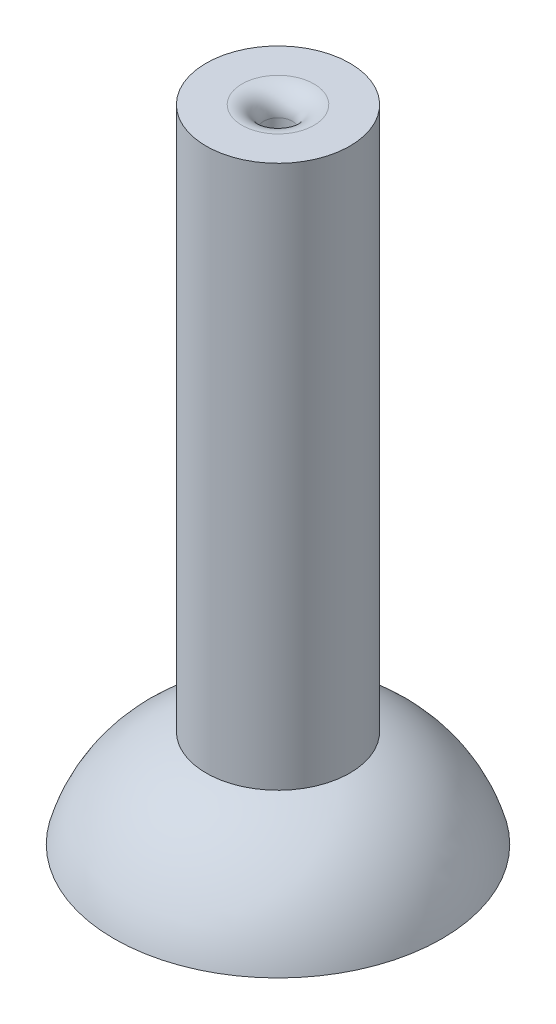
ISO-10303-21;
HEADER;
FILE_DESCRIPTION(('STEP AP214'),'2;1');
FILE_NAME('part.step','',(''),(''),'','','');
FILE_SCHEMA(('AUTOMOTIVE_DESIGN { 1 0 10303 214 1 1 1 1 }'));
ENDSEC;
DATA;
#1=APPLICATION_CONTEXT('core data for automotive mechanical design processes');
#2=APPLICATION_PROTOCOL_DEFINITION('international standard','automotive_design',2000,#1);
#3=PRODUCT_CONTEXT('',#1,'mechanical');
#4=PRODUCT('Part','Part','',(#3));
#5=PRODUCT_RELATED_PRODUCT_CATEGORY('part','',(#4));
#6=PRODUCT_DEFINITION_FORMATION('','',#4);
#7=PRODUCT_DEFINITION_CONTEXT('part definition',#1,'design');
#8=PRODUCT_DEFINITION('design','',#6,#7);
#9=PRODUCT_DEFINITION_SHAPE('','',#8);
#10=(LENGTH_UNIT() NAMED_UNIT(*) SI_UNIT(.MILLI.,.METRE.));
#11=(NAMED_UNIT(*) PLANE_ANGLE_UNIT() SI_UNIT($,.RADIAN.));
#12=(NAMED_UNIT(*) SI_UNIT($,.STERADIAN.) SOLID_ANGLE_UNIT());
#13=UNCERTAINTY_MEASURE_WITH_UNIT(LENGTH_MEASURE(1.E-05),#10,'distance_accuracy_value','');
#14=(GEOMETRIC_REPRESENTATION_CONTEXT(3) GLOBAL_UNCERTAINTY_ASSIGNED_CONTEXT((#13)) GLOBAL_UNIT_ASSIGNED_CONTEXT((#10,
#11,#12)) REPRESENTATION_CONTEXT('',''));
#15=CARTESIAN_POINT('',(0.,0.,0.));
#16=DIRECTION('',(0.,0.,1.));
#17=DIRECTION('',(1.,0.,0.));
#18=AXIS2_PLACEMENT_3D('',#15,#16,#17);
#19=CARTESIAN_POINT('',(0.,0.,0.));
#20=DIRECTION('',(0.,1.,0.));
#21=DIRECTION('',(0.,0.,1.));
#22=AXIS2_PLACEMENT_3D('',#19,#20,#21);
#23=PLANE('',#22);
#24=DIRECTION('',(0.,0.,-1.));
#25=VECTOR('',#24,1.);
#26=CARTESIAN_POINT('',(-1.5,0.,0.));
#27=LINE('',#26,#25);
#28=CARTESIAN_POINT('',(-1.5,0.,2.));
#29=VERTEX_POINT('',#28);
#30=CARTESIAN_POINT('',(-1.5,0.,-2.));
#31=VERTEX_POINT('',#30);
#32=EDGE_CURVE('E83',#29,#31,#27,.T.);
#33=ORIENTED_EDGE('',*,*,#32,.F.);
#34=CARTESIAN_POINT('',(0.,0.,0.));
#35=DIRECTION('',(0.,-1.,0.));
#36=DIRECTION('',(0.,0.,-1.));
#37=AXIS2_PLACEMENT_3D('',#34,#35,#36);
#38=CIRCLE('',#37,2.5);
#39=CARTESIAN_POINT('',(1.5,0.,2.));
#40=VERTEX_POINT('',#39);
#41=EDGE_CURVE('E48',#40,#29,#38,.T.);
#42=ORIENTED_EDGE('',*,*,#41,.F.);
#43=DIRECTION('',(0.,0.,-1.));
#44=VECTOR('',#43,1.);
#45=CARTESIAN_POINT('',(1.5,0.,0.));
#46=LINE('',#45,#44);
#47=CARTESIAN_POINT('',(1.5,0.,-2.));
#48=VERTEX_POINT('',#47);
#49=EDGE_CURVE('E99',#40,#48,#46,.T.);
#50=ORIENTED_EDGE('',*,*,#49,.T.);
#51=CARTESIAN_POINT('',(0.,0.,0.));
#52=DIRECTION('',(0.,-1.,0.));
#53=DIRECTION('',(0.,0.,-1.));
#54=AXIS2_PLACEMENT_3D('',#51,#52,#53);
#55=CIRCLE('',#54,2.5);
#56=EDGE_CURVE('E105',#31,#48,#55,.T.);
#57=ORIENTED_EDGE('',*,*,#56,.F.);
#58=EDGE_LOOP('',(#33,#42,#50,#57));
#59=FACE_BOUND('',#58,.T.);
#60=CARTESIAN_POINT('',(0.,0.,0.));
#61=DIRECTION('',(0.,-1.,0.));
#62=DIRECTION('',(0.,0.,-1.));
#63=AXIS2_PLACEMENT_3D('',#60,#61,#62);
#64=CIRCLE('',#63,3.00028687286989);
#65=CARTESIAN_POINT('',(0.,0.,-3.00028687286989));
#66=VERTEX_POINT('',#65);
#67=EDGE_CURVE('E110',#66,#66,#64,.T.);
#68=ORIENTED_EDGE('',*,*,#67,.T.);
#69=EDGE_LOOP('',(#68));
#70=FACE_BOUND('',#69,.T.);
#71=ADVANCED_FACE('F33',(#59,#70),#23,.F.);
#72=CARTESIAN_POINT('',(-1.,35.,0.));
#73=DIRECTION('',(0.,-1.,0.));
#74=DIRECTION('',(0.,0.,-1.));
#75=AXIS2_PLACEMENT_3D('',#72,#73,#74);
#76=PLANE('',#75);
#77=CARTESIAN_POINT('',(0.,35.,0.));
#78=DIRECTION('',(0.,-1.,0.));
#79=DIRECTION('',(0.,0.,-1.));
#80=AXIS2_PLACEMENT_3D('',#77,#78,#79);
#81=CIRCLE('',#80,1.);
#82=CARTESIAN_POINT('',(0.,35.,-1.));
#83=VERTEX_POINT('',#82);
#84=EDGE_CURVE('E130',#83,#83,#81,.T.);
#85=ORIENTED_EDGE('',*,*,#84,.F.);
#86=EDGE_LOOP('',(#85));
#87=FACE_BOUND('',#86,.T.);
#88=ADVANCED_FACE('F146',(#87),#76,.F.);
#89=CARTESIAN_POINT('',(0.,-4.47434306645324,0.));
#90=DIRECTION('',(0.,-1.,0.));
#91=DIRECTION('',(0.,0.,-1.));
#92=AXIS2_PLACEMENT_3D('',#89,#90,#91);
#93=CYLINDRICAL_SURFACE('',#92,1.);
#94=CARTESIAN_POINT('',(0.,38.5,0.));
#95=DIRECTION('',(0.,-1.,0.));
#96=DIRECTION('',(0.,0.,-1.));
#97=AXIS2_PLACEMENT_3D('',#94,#95,#96);
#98=CIRCLE('',#97,1.);
#99=CARTESIAN_POINT('',(0.,38.5,-1.));
#100=VERTEX_POINT('',#99);
#101=EDGE_CURVE('E11',#100,#100,#98,.F.);
#102=ORIENTED_EDGE('',*,*,#101,.T.);
#103=EDGE_LOOP('',(#102));
#104=FACE_BOUND('',#103,.T.);
#105=ORIENTED_EDGE('',*,*,#84,.T.);
#106=EDGE_LOOP('',(#105));
#107=FACE_BOUND('',#106,.T.);
#108=ADVANCED_FACE('F151',(#104,#107),#93,.F.);
#109=CARTESIAN_POINT('',(-5.,40.,0.));
#110=DIRECTION('',(0.,-1.,0.));
#111=DIRECTION('',(0.,0.,-1.));
#112=AXIS2_PLACEMENT_3D('',#109,#110,#111);
#113=PLANE('',#112);
#114=CARTESIAN_POINT('',(0.,40.,0.));
#115=DIRECTION('',(0.,-1.,0.));
#116=DIRECTION('',(0.,0.,-1.));
#117=AXIS2_PLACEMENT_3D('',#114,#115,#116);
#118=CIRCLE('',#117,2.5);
#119=CARTESIAN_POINT('',(0.,40.,-2.5));
#120=VERTEX_POINT('',#119);
#121=EDGE_CURVE('E41',#120,#120,#118,.T.);
#122=ORIENTED_EDGE('',*,*,#121,.T.);
#123=EDGE_LOOP('',(#122));
#124=FACE_BOUND('',#123,.T.);
#125=CARTESIAN_POINT('',(0.,40.,0.));
#126=DIRECTION('',(0.,-1.,0.));
#127=DIRECTION('',(0.,0.,-1.));
#128=AXIS2_PLACEMENT_3D('',#125,#126,#127);
#129=CIRCLE('',#128,5.);
#130=CARTESIAN_POINT('',(0.,40.,-5.));
#131=VERTEX_POINT('',#130);
#132=EDGE_CURVE('E127',#131,#131,#129,.T.);
#133=ORIENTED_EDGE('',*,*,#132,.F.);
#134=EDGE_LOOP('',(#133));
#135=FACE_BOUND('',#134,.T.);
#136=ADVANCED_FACE('F135',(#124,#135),#113,.F.);
#137=CARTESIAN_POINT('',(0.,-4.47434306645324,0.));
#138=DIRECTION('',(0.,-1.,0.));
#139=DIRECTION('',(0.,0.,-1.));
#140=AXIS2_PLACEMENT_3D('',#137,#138,#139);
#141=CYLINDRICAL_SURFACE('',#140,5.);
#142=CARTESIAN_POINT('',(0.,2.22855816175974,0.));
#143=DIRECTION('',(0.,-1.,0.));
#144=DIRECTION('',(0.,0.,-1.));
#145=AXIS2_PLACEMENT_3D('',#142,#143,#144);
#146=CIRCLE('',#145,5.);
#147=CARTESIAN_POINT('',(0.,2.22855816175974,-5.));
#148=VERTEX_POINT('',#147);
#149=EDGE_CURVE('E124',#148,#148,#146,.T.);
#150=ORIENTED_EDGE('',*,*,#149,.F.);
#151=EDGE_LOOP('',(#150));
#152=FACE_BOUND('',#151,.T.);
#153=ORIENTED_EDGE('',*,*,#132,.T.);
#154=EDGE_LOOP('',(#153));
#155=FACE_BOUND('',#154,.T.);
#156=ADVANCED_FACE('F161',(#152,#155),#141,.T.);
#157=CARTESIAN_POINT('',(0.,-7.18526820392972,0.));
#158=DIRECTION('',(0.,-1.,0.));
#159=DIRECTION('',(0.,0.,-1.));
#160=AXIS2_PLACEMENT_3D('',#157,#158,#159);
#161=DEGENERATE_TOROIDAL_SURFACE('',#160,1.81777407852082,9.93713684411582,.T.);
#162=CARTESIAN_POINT('',(0.,-4.55324133204643,0.));
#163=DIRECTION('',(0.,-1.,0.));
#164=DIRECTION('',(0.,0.,-1.));
#165=AXIS2_PLACEMENT_3D('',#162,#163,#164);
#166=CIRCLE('',#165,11.4000036314155);
#167=CARTESIAN_POINT('',(0.,-4.55324133204643,-11.4000036314155));
#168=VERTEX_POINT('',#167);
#169=EDGE_CURVE('E121',#168,#168,#166,.T.);
#170=ORIENTED_EDGE('',*,*,#169,.F.);
#171=EDGE_LOOP('',(#170));
#172=FACE_BOUND('',#171,.T.);
#173=ORIENTED_EDGE('',*,*,#149,.T.);
#174=EDGE_LOOP('',(#173));
#175=FACE_BOUND('',#174,.T.);
#176=ADVANCED_FACE('F164',(#172,#175),#161,.T.);
#177=CARTESIAN_POINT('',(-11.4000036314155,-4.55324133204643,0.));
#178=DIRECTION('',(0.,1.,0.));
#179=DIRECTION('',(0.,0.,1.));
#180=AXIS2_PLACEMENT_3D('',#177,#178,#179);
#181=PLANE('',#180);
#182=CARTESIAN_POINT('',(0.,-4.55324133204643,0.));
#183=DIRECTION('',(0.,-1.,0.));
#184=DIRECTION('',(0.,0.,-1.));
#185=AXIS2_PLACEMENT_3D('',#182,#183,#184);
#186=CIRCLE('',#185,9.9000036314155);
#187=CARTESIAN_POINT('',(0.,-4.55324133204643,-9.9000036314155));
#188=VERTEX_POINT('',#187);
#189=EDGE_CURVE('E118',#188,#188,#186,.T.);
#190=ORIENTED_EDGE('',*,*,#189,.F.);
#191=EDGE_LOOP('',(#190));
#192=FACE_BOUND('',#191,.T.);
#193=ORIENTED_EDGE('',*,*,#169,.T.);
#194=EDGE_LOOP('',(#193));
#195=FACE_BOUND('',#194,.T.);
#196=ADVANCED_FACE('F168',(#192,#195),#181,.F.);
#197=CARTESIAN_POINT('',(0.,-7.18526820392972,0.));
#198=DIRECTION('',(0.,-1.,0.));
#199=DIRECTION('',(0.,0.,-1.));
#200=AXIS2_PLACEMENT_3D('',#197,#198,#199);
#201=DEGENERATE_TOROIDAL_SURFACE('',#200,1.81777407852082,8.5,.T.);
#202=CARTESIAN_POINT('',(0.,0.703110012343493,0.));
#203=DIRECTION('',(0.,-1.,0.));
#204=DIRECTION('',(0.,0.,-1.));
#205=AXIS2_PLACEMENT_3D('',#202,#203,#204);
#206=CIRCLE('',#205,4.98376351580992);
#207=CARTESIAN_POINT('',(0.,0.703110012343493,-4.98376351580992));
#208=VERTEX_POINT('',#207);
#209=EDGE_CURVE('E115',#208,#208,#206,.T.);
#210=ORIENTED_EDGE('',*,*,#209,.F.);
#211=EDGE_LOOP('',(#210));
#212=FACE_BOUND('',#211,.T.);
#213=ORIENTED_EDGE('',*,*,#189,.T.);
#214=EDGE_LOOP('',(#213));
#215=FACE_BOUND('',#214,.T.);
#216=ADVANCED_FACE('F172',(#212,#215),#201,.F.);
#217=CARTESIAN_POINT('',(0.,0.703110012343493,0.));
#218=DIRECTION('',(0.,1.,0.));
#219=DIRECTION('',(0.,0.,1.));
#220=AXIS2_PLACEMENT_3D('',#217,#218,#219);
#221=CONICAL_SURFACE('',#220,4.98376351580992,1.2301327743757);
#222=ORIENTED_EDGE('',*,*,#67,.F.);
#223=EDGE_LOOP('',(#222));
#224=FACE_BOUND('',#223,.T.);
#225=ORIENTED_EDGE('',*,*,#209,.T.);
#226=EDGE_LOOP('',(#225));
#227=FACE_BOUND('',#226,.T.);
#228=ADVANCED_FACE('F176',(#224,#227),#221,.T.);
#229=CARTESIAN_POINT('',(0.,5.,0.));
#230=DIRECTION('',(0.,-1.,0.));
#231=DIRECTION('',(0.,0.,-1.));
#232=AXIS2_PLACEMENT_3D('',#229,#230,#231);
#233=CYLINDRICAL_SURFACE('',#232,2.5);
#234=ORIENTED_EDGE('',*,*,#41,.T.);
#235=DIRECTION('',(0.,-1.,0.));
#236=VECTOR('',#235,1.);
#237=CARTESIAN_POINT('',(-1.5,5.,2.));
#238=LINE('',#237,#236);
#239=CARTESIAN_POINT('',(-1.5,5.,2.));
#240=VERTEX_POINT('',#239);
#241=EDGE_CURVE('E71',#240,#29,#238,.T.);
#242=ORIENTED_EDGE('',*,*,#241,.F.);
#243=CARTESIAN_POINT('',(0.,5.,0.));
#244=DIRECTION('',(0.,-1.,0.));
#245=DIRECTION('',(0.,0.,-1.));
#246=AXIS2_PLACEMENT_3D('',#243,#244,#245);
#247=CIRCLE('',#246,2.5);
#248=CARTESIAN_POINT('',(1.5,5.,2.));
#249=VERTEX_POINT('',#248);
#250=EDGE_CURVE('E97',#249,#240,#247,.T.);
#251=ORIENTED_EDGE('',*,*,#250,.F.);
#252=DIRECTION('',(0.,-1.,0.));
#253=VECTOR('',#252,1.);
#254=CARTESIAN_POINT('',(1.5,5.,2.));
#255=LINE('',#254,#253);
#256=EDGE_CURVE('E56',#249,#40,#255,.T.);
#257=ORIENTED_EDGE('',*,*,#256,.T.);
#258=EDGE_LOOP('',(#234,#242,#251,#257));
#259=FACE_BOUND('',#258,.T.);
#260=ADVANCED_FACE('F180',(#259),#233,.F.);
#261=CARTESIAN_POINT('',(1.5,5.,0.));
#262=DIRECTION('',(-1.,0.,0.));
#263=DIRECTION('',(0.,0.,1.));
#264=AXIS2_PLACEMENT_3D('',#261,#262,#263);
#265=PLANE('',#264);
#266=ORIENTED_EDGE('',*,*,#49,.F.);
#267=ORIENTED_EDGE('',*,*,#256,.F.);
#268=DIRECTION('',(0.,0.,-1.));
#269=VECTOR('',#268,1.);
#270=CARTESIAN_POINT('',(1.5,5.,0.));
#271=LINE('',#270,#269);
#272=CARTESIAN_POINT('',(1.5,5.,-2.));
#273=VERTEX_POINT('',#272);
#274=EDGE_CURVE('E94',#249,#273,#271,.T.);
#275=ORIENTED_EDGE('',*,*,#274,.T.);
#276=DIRECTION('',(0.,-1.,0.));
#277=VECTOR('',#276,1.);
#278=CARTESIAN_POINT('',(1.5,5.,-2.));
#279=LINE('',#278,#277);
#280=EDGE_CURVE('E87',#273,#48,#279,.T.);
#281=ORIENTED_EDGE('',*,*,#280,.T.);
#282=EDGE_LOOP('',(#266,#267,#275,#281));
#283=FACE_BOUND('',#282,.T.);
#284=ADVANCED_FACE('F184',(#283),#265,.T.);
#285=CARTESIAN_POINT('',(0.,5.,0.));
#286=DIRECTION('',(0.,-1.,0.));
#287=DIRECTION('',(0.,0.,-1.));
#288=AXIS2_PLACEMENT_3D('',#285,#286,#287);
#289=CYLINDRICAL_SURFACE('',#288,2.5);
#290=ORIENTED_EDGE('',*,*,#56,.T.);
#291=ORIENTED_EDGE('',*,*,#280,.F.);
#292=CARTESIAN_POINT('',(0.,5.,0.));
#293=DIRECTION('',(0.,-1.,0.));
#294=DIRECTION('',(0.,0.,-1.));
#295=AXIS2_PLACEMENT_3D('',#292,#293,#294);
#296=CIRCLE('',#295,2.5);
#297=CARTESIAN_POINT('',(-1.5,5.,-2.));
#298=VERTEX_POINT('',#297);
#299=EDGE_CURVE('E91',#298,#273,#296,.T.);
#300=ORIENTED_EDGE('',*,*,#299,.F.);
#301=DIRECTION('',(0.,-1.,0.));
#302=VECTOR('',#301,1.);
#303=CARTESIAN_POINT('',(-1.5,5.,-2.));
#304=LINE('',#303,#302);
#305=EDGE_CURVE('E76',#298,#31,#304,.T.);
#306=ORIENTED_EDGE('',*,*,#305,.T.);
#307=EDGE_LOOP('',(#290,#291,#300,#306));
#308=FACE_BOUND('',#307,.T.);
#309=ADVANCED_FACE('F92',(#308),#289,.F.);
#310=CARTESIAN_POINT('',(-1.5,5.,0.));
#311=DIRECTION('',(-1.,0.,0.));
#312=DIRECTION('',(0.,0.,1.));
#313=AXIS2_PLACEMENT_3D('',#310,#311,#312);
#314=PLANE('',#313);
#315=ORIENTED_EDGE('',*,*,#32,.T.);
#316=ORIENTED_EDGE('',*,*,#305,.F.);
#317=DIRECTION('',(0.,0.,-1.));
#318=VECTOR('',#317,1.);
#319=CARTESIAN_POINT('',(-1.5,5.,0.));
#320=LINE('',#319,#318);
#321=EDGE_CURVE('E80',#240,#298,#320,.T.);
#322=ORIENTED_EDGE('',*,*,#321,.F.);
#323=ORIENTED_EDGE('',*,*,#241,.T.);
#324=EDGE_LOOP('',(#315,#316,#322,#323));
#325=FACE_BOUND('',#324,.T.);
#326=ADVANCED_FACE('F78',(#325),#314,.F.);
#327=CARTESIAN_POINT('',(0.,5.,0.));
#328=DIRECTION('',(0.,-1.,0.));
#329=DIRECTION('',(0.,0.,-1.));
#330=AXIS2_PLACEMENT_3D('',#327,#328,#329);
#331=PLANE('',#330);
#332=ORIENTED_EDGE('',*,*,#250,.T.);
#333=ORIENTED_EDGE('',*,*,#321,.T.);
#334=ORIENTED_EDGE('',*,*,#299,.T.);
#335=ORIENTED_EDGE('',*,*,#274,.F.);
#336=EDGE_LOOP('',(#332,#333,#334,#335));
#337=FACE_BOUND('',#336,.T.);
#338=ADVANCED_FACE('F96',(#337),#331,.T.);
#339=CARTESIAN_POINT('',(0.,38.5,0.));
#340=DIRECTION('',(0.,-1.,0.));
#341=DIRECTION('',(0.,0.,-1.));
#342=AXIS2_PLACEMENT_3D('',#339,#340,#341);
#343=TOROIDAL_SURFACE('',#342,2.5,1.5);
#344=ORIENTED_EDGE('',*,*,#101,.F.);
#345=EDGE_LOOP('',(#344));
#346=FACE_BOUND('',#345,.T.);
#347=ORIENTED_EDGE('',*,*,#121,.F.);
#348=EDGE_LOOP('',(#347));
#349=FACE_BOUND('',#348,.T.);
#350=ADVANCED_FACE('F35',(#346,#349),#343,.T.);
#351=CLOSED_SHELL('',(#71,#88,#108,#136,#156,#176,#196,#216,#228,#260,#284,#309,#326,#338,#350));
#352=MANIFOLD_SOLID_BREP('B2',#351);
#353=ADVANCED_BREP_SHAPE_REPRESENTATION('',(#18,#352),#14);
#354=SHAPE_DEFINITION_REPRESENTATION(#9,#353);
ENDSEC;
END-ISO-10303-21;
